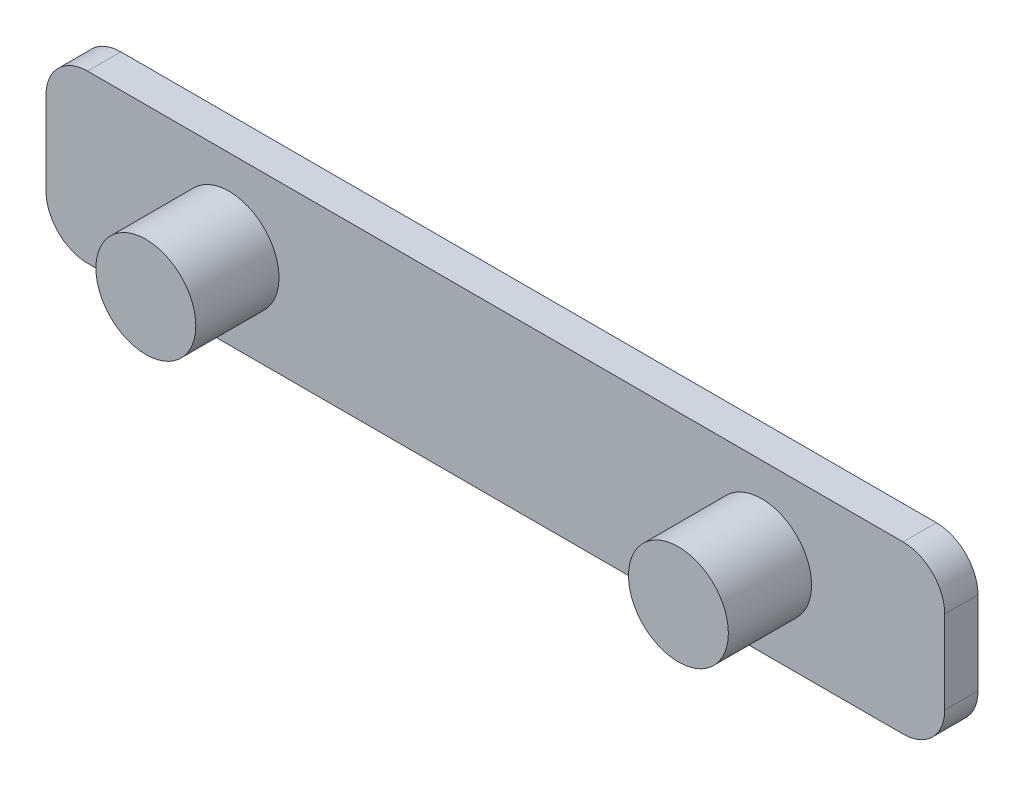
ISO-10303-21;
HEADER;
FILE_DESCRIPTION(('STEP AP214'),'2;1');
FILE_NAME('part.step','',(''),(''),'','','');
FILE_SCHEMA(('AUTOMOTIVE_DESIGN { 1 0 10303 214 1 1 1 1 }'));
ENDSEC;
DATA;
#1=APPLICATION_CONTEXT('core data for automotive mechanical design processes');
#2=APPLICATION_PROTOCOL_DEFINITION('international standard','automotive_design',2000,#1);
#3=PRODUCT_CONTEXT('',#1,'mechanical');
#4=PRODUCT('Part','Part','',(#3));
#5=PRODUCT_RELATED_PRODUCT_CATEGORY('part','',(#4));
#6=PRODUCT_DEFINITION_FORMATION('','',#4);
#7=PRODUCT_DEFINITION_CONTEXT('part definition',#1,'design');
#8=PRODUCT_DEFINITION('design','',#6,#7);
#9=PRODUCT_DEFINITION_SHAPE('','',#8);
#10=(LENGTH_UNIT() NAMED_UNIT(*) SI_UNIT(.MILLI.,.METRE.));
#11=(NAMED_UNIT(*) PLANE_ANGLE_UNIT() SI_UNIT($,.RADIAN.));
#12=(NAMED_UNIT(*) SI_UNIT($,.STERADIAN.) SOLID_ANGLE_UNIT());
#13=UNCERTAINTY_MEASURE_WITH_UNIT(LENGTH_MEASURE(1.E-05),#10,'distance_accuracy_value','');
#14=(GEOMETRIC_REPRESENTATION_CONTEXT(3) GLOBAL_UNCERTAINTY_ASSIGNED_CONTEXT((#13)) GLOBAL_UNIT_ASSIGNED_CONTEXT((#10,
#11,#12)) REPRESENTATION_CONTEXT('',''));
#15=CARTESIAN_POINT('',(0.,0.,0.));
#16=DIRECTION('',(0.,0.,1.));
#17=DIRECTION('',(1.,0.,0.));
#18=AXIS2_PLACEMENT_3D('',#15,#16,#17);
#19=CARTESIAN_POINT('',(-5.31333795137197,1.33941413235611,2.));
#20=DIRECTION('',(0.,0.,-1.));
#21=DIRECTION('',(-1.,0.,0.));
#22=AXIS2_PLACEMENT_3D('',#19,#20,#21);
#23=CYLINDRICAL_SURFACE('',#22,2.5);
#24=CARTESIAN_POINT('',(-5.31333795137197,1.33941413235611,0.));
#25=DIRECTION('',(0.,0.,1.));
#26=DIRECTION('',(-1.,0.,0.));
#27=AXIS2_PLACEMENT_3D('',#24,#25,#26);
#28=CIRCLE('',#27,2.5);
#29=CARTESIAN_POINT('',(-5.31333795137195,3.83941413235611,0.));
#30=VERTEX_POINT('',#29);
#31=CARTESIAN_POINT('',(-7.81333795137197,1.33941413235609,0.));
#32=VERTEX_POINT('',#31);
#33=EDGE_CURVE('E140',#30,#32,#28,.T.);
#34=ORIENTED_EDGE('',*,*,#33,.T.);
#35=DIRECTION('',(0.,0.,-1.));
#36=VECTOR('',#35,1.);
#37=CARTESIAN_POINT('',(-7.81333795137197,1.33941413235609,2.));
#38=LINE('',#37,#36);
#39=CARTESIAN_POINT('',(-7.81333795137197,1.33941413235609,2.));
#40=VERTEX_POINT('',#39);
#41=EDGE_CURVE('E168',#40,#32,#38,.T.);
#42=ORIENTED_EDGE('',*,*,#41,.F.);
#43=CARTESIAN_POINT('',(-5.31333795137197,1.33941413235611,2.));
#44=DIRECTION('',(0.,0.,1.));
#45=DIRECTION('',(-1.,0.,0.));
#46=AXIS2_PLACEMENT_3D('',#43,#44,#45);
#47=CIRCLE('',#46,2.5);
#48=CARTESIAN_POINT('',(-5.31333795137195,3.83941413235611,2.));
#49=VERTEX_POINT('',#48);
#50=EDGE_CURVE('E155',#49,#40,#47,.T.);
#51=ORIENTED_EDGE('',*,*,#50,.F.);
#52=DIRECTION('',(0.,0.,-1.));
#53=VECTOR('',#52,1.);
#54=CARTESIAN_POINT('',(-5.31333795137195,3.83941413235611,2.));
#55=LINE('',#54,#53);
#56=EDGE_CURVE('E136',#49,#30,#55,.T.);
#57=ORIENTED_EDGE('',*,*,#56,.T.);
#58=EDGE_LOOP('',(#34,#42,#51,#57));
#59=FACE_BOUND('',#58,.T.);
#60=ADVANCED_FACE('F43',(#59),#23,.T.);
#61=CARTESIAN_POINT('',(-7.81333795137197,1.33941413235609,2.));
#62=DIRECTION('',(1.,0.,0.));
#63=DIRECTION('',(0.,1.,0.));
#64=AXIS2_PLACEMENT_3D('',#61,#62,#63);
#65=PLANE('',#64);
#66=DIRECTION('',(0.,-1.,0.));
#67=VECTOR('',#66,1.);
#68=CARTESIAN_POINT('',(-7.81333795137197,1.33941413235609,0.));
#69=LINE('',#68,#67);
#70=CARTESIAN_POINT('',(-7.81333795137197,-3.66058586764387,0.));
#71=VERTEX_POINT('',#70);
#72=EDGE_CURVE('E143',#32,#71,#69,.T.);
#73=ORIENTED_EDGE('',*,*,#72,.T.);
#74=DIRECTION('',(0.,0.,-1.));
#75=VECTOR('',#74,1.);
#76=CARTESIAN_POINT('',(-7.81333795137197,-3.66058586764387,2.));
#77=LINE('',#76,#75);
#78=CARTESIAN_POINT('',(-7.81333795137197,-3.66058586764387,2.));
#79=VERTEX_POINT('',#78);
#80=EDGE_CURVE('E165',#79,#71,#77,.T.);
#81=ORIENTED_EDGE('',*,*,#80,.F.);
#82=DIRECTION('',(0.,-1.,0.));
#83=VECTOR('',#82,1.);
#84=CARTESIAN_POINT('',(-7.81333795137197,1.33941413235609,2.));
#85=LINE('',#84,#83);
#86=EDGE_CURVE('E103',#40,#79,#85,.T.);
#87=ORIENTED_EDGE('',*,*,#86,.F.);
#88=ORIENTED_EDGE('',*,*,#41,.T.);
#89=EDGE_LOOP('',(#73,#81,#87,#88));
#90=FACE_BOUND('',#89,.T.);
#91=ADVANCED_FACE('F190',(#90),#65,.F.);
#92=CARTESIAN_POINT('',(-5.31333795137197,-3.66058586764389,2.));
#93=DIRECTION('',(0.,0.,-1.));
#94=DIRECTION('',(-1.,0.,0.));
#95=AXIS2_PLACEMENT_3D('',#92,#93,#94);
#96=CYLINDRICAL_SURFACE('',#95,2.5);
#97=CARTESIAN_POINT('',(-5.31333795137197,-3.66058586764389,0.));
#98=DIRECTION('',(0.,0.,1.));
#99=DIRECTION('',(1.,0.,0.));
#100=AXIS2_PLACEMENT_3D('',#97,#98,#99);
#101=CIRCLE('',#100,2.5);
#102=CARTESIAN_POINT('',(-5.31333795137196,-6.16058586764389,0.));
#103=VERTEX_POINT('',#102);
#104=EDGE_CURVE('E146',#71,#103,#101,.T.);
#105=ORIENTED_EDGE('',*,*,#104,.T.);
#106=DIRECTION('',(0.,0.,-1.));
#107=VECTOR('',#106,1.);
#108=CARTESIAN_POINT('',(-5.31333795137196,-6.16058586764389,2.));
#109=LINE('',#108,#107);
#110=CARTESIAN_POINT('',(-5.31333795137196,-6.16058586764389,2.));
#111=VERTEX_POINT('',#110);
#112=EDGE_CURVE('E162',#111,#103,#109,.T.);
#113=ORIENTED_EDGE('',*,*,#112,.F.);
#114=CARTESIAN_POINT('',(-5.31333795137197,-3.66058586764389,2.));
#115=DIRECTION('',(0.,0.,1.));
#116=DIRECTION('',(1.,0.,0.));
#117=AXIS2_PLACEMENT_3D('',#114,#115,#116);
#118=CIRCLE('',#117,2.5);
#119=EDGE_CURVE('E204',#79,#111,#118,.T.);
#120=ORIENTED_EDGE('',*,*,#119,.F.);
#121=ORIENTED_EDGE('',*,*,#80,.T.);
#122=EDGE_LOOP('',(#105,#113,#120,#121));
#123=FACE_BOUND('',#122,.T.);
#124=ADVANCED_FACE('F195',(#123),#96,.T.);
#125=CARTESIAN_POINT('',(-5.31333795137195,-6.16058586764389,2.));
#126=DIRECTION('',(0.,1.,0.));
#127=DIRECTION('',(0.,0.,1.));
#128=AXIS2_PLACEMENT_3D('',#125,#126,#127);
#129=PLANE('',#128);
#130=DIRECTION('',(1.,0.,0.));
#131=VECTOR('',#130,1.);
#132=CARTESIAN_POINT('',(-5.31333795137195,-6.16058586764389,0.));
#133=LINE('',#132,#131);
#134=CARTESIAN_POINT('',(43.686662048628,-6.16058586764389,0.));
#135=VERTEX_POINT('',#134);
#136=EDGE_CURVE('E148',#103,#135,#133,.T.);
#137=ORIENTED_EDGE('',*,*,#136,.T.);
#138=DIRECTION('',(0.,0.,-1.));
#139=VECTOR('',#138,1.);
#140=CARTESIAN_POINT('',(43.686662048628,-6.16058586764389,2.));
#141=LINE('',#140,#139);
#142=CARTESIAN_POINT('',(43.686662048628,-6.16058586764389,2.));
#143=VERTEX_POINT('',#142);
#144=EDGE_CURVE('E159',#143,#135,#141,.T.);
#145=ORIENTED_EDGE('',*,*,#144,.F.);
#146=DIRECTION('',(1.,0.,0.));
#147=VECTOR('',#146,1.);
#148=CARTESIAN_POINT('',(-5.31333795137195,-6.16058586764389,2.));
#149=LINE('',#148,#147);
#150=EDGE_CURVE('E206',#111,#143,#149,.T.);
#151=ORIENTED_EDGE('',*,*,#150,.F.);
#152=ORIENTED_EDGE('',*,*,#112,.T.);
#153=EDGE_LOOP('',(#137,#145,#151,#152));
#154=FACE_BOUND('',#153,.T.);
#155=ADVANCED_FACE('F290',(#154),#129,.F.);
#156=CARTESIAN_POINT('',(43.686662048628,-3.66058586764389,2.));
#157=DIRECTION('',(0.,0.,-1.));
#158=DIRECTION('',(-1.,0.,0.));
#159=AXIS2_PLACEMENT_3D('',#156,#157,#158);
#160=CYLINDRICAL_SURFACE('',#159,2.5);
#161=CARTESIAN_POINT('',(43.686662048628,-3.66058586764389,0.));
#162=DIRECTION('',(0.,0.,1.));
#163=DIRECTION('',(-1.,0.,0.));
#164=AXIS2_PLACEMENT_3D('',#161,#162,#163);
#165=CIRCLE('',#164,2.5);
#166=CARTESIAN_POINT('',(46.186662048628,-3.66058586764389,0.));
#167=VERTEX_POINT('',#166);
#168=EDGE_CURVE('E150',#135,#167,#165,.T.);
#169=ORIENTED_EDGE('',*,*,#168,.T.);
#170=DIRECTION('',(0.,0.,-1.));
#171=VECTOR('',#170,1.);
#172=CARTESIAN_POINT('',(46.186662048628,-3.66058586764389,2.));
#173=LINE('',#172,#171);
#174=CARTESIAN_POINT('',(46.186662048628,-3.66058586764389,2.));
#175=VERTEX_POINT('',#174);
#176=EDGE_CURVE('E131',#175,#167,#173,.T.);
#177=ORIENTED_EDGE('',*,*,#176,.F.);
#178=CARTESIAN_POINT('',(43.686662048628,-3.66058586764389,2.));
#179=DIRECTION('',(0.,0.,1.));
#180=DIRECTION('',(-1.,0.,0.));
#181=AXIS2_PLACEMENT_3D('',#178,#179,#180);
#182=CIRCLE('',#181,2.5);
#183=EDGE_CURVE('E122',#143,#175,#182,.T.);
#184=ORIENTED_EDGE('',*,*,#183,.F.);
#185=ORIENTED_EDGE('',*,*,#144,.T.);
#186=EDGE_LOOP('',(#169,#177,#184,#185));
#187=FACE_BOUND('',#186,.T.);
#188=ADVANCED_FACE('F282',(#187),#160,.T.);
#189=CARTESIAN_POINT('',(46.186662048628,1.33941413235611,2.));
#190=DIRECTION('',(-1.,0.,0.));
#191=DIRECTION('',(0.,0.,1.));
#192=AXIS2_PLACEMENT_3D('',#189,#190,#191);
#193=PLANE('',#192);
#194=DIRECTION('',(0.,1.,0.));
#195=VECTOR('',#194,1.);
#196=CARTESIAN_POINT('',(46.186662048628,1.33941413235611,0.));
#197=LINE('',#196,#195);
#198=CARTESIAN_POINT('',(46.186662048628,1.33941413235611,0.));
#199=VERTEX_POINT('',#198);
#200=EDGE_CURVE('E130',#167,#199,#197,.T.);
#201=ORIENTED_EDGE('',*,*,#200,.T.);
#202=DIRECTION('',(0.,0.,-1.));
#203=VECTOR('',#202,1.);
#204=CARTESIAN_POINT('',(46.186662048628,1.33941413235611,2.));
#205=LINE('',#204,#203);
#206=CARTESIAN_POINT('',(46.186662048628,1.33941413235611,2.));
#207=VERTEX_POINT('',#206);
#208=EDGE_CURVE('E127',#207,#199,#205,.T.);
#209=ORIENTED_EDGE('',*,*,#208,.F.);
#210=DIRECTION('',(0.,1.,0.));
#211=VECTOR('',#210,1.);
#212=CARTESIAN_POINT('',(46.186662048628,1.33941413235611,2.));
#213=LINE('',#212,#211);
#214=EDGE_CURVE('E116',#175,#207,#213,.T.);
#215=ORIENTED_EDGE('',*,*,#214,.F.);
#216=ORIENTED_EDGE('',*,*,#176,.T.);
#217=EDGE_LOOP('',(#201,#209,#215,#216));
#218=FACE_BOUND('',#217,.T.);
#219=ADVANCED_FACE('F128',(#218),#193,.F.);
#220=CARTESIAN_POINT('',(43.686662048628,1.33941413235611,2.));
#221=DIRECTION('',(0.,0.,-1.));
#222=DIRECTION('',(-1.,0.,0.));
#223=AXIS2_PLACEMENT_3D('',#220,#221,#222);
#224=CYLINDRICAL_SURFACE('',#223,2.5);
#225=CARTESIAN_POINT('',(43.686662048628,1.33941413235611,0.));
#226=DIRECTION('',(0.,0.,1.));
#227=DIRECTION('',(1.,0.,0.));
#228=AXIS2_PLACEMENT_3D('',#225,#226,#227);
#229=CIRCLE('',#228,2.5);
#230=CARTESIAN_POINT('',(43.686662048628,3.83941413235611,0.));
#231=VERTEX_POINT('',#230);
#232=EDGE_CURVE('E88',#199,#231,#229,.T.);
#233=ORIENTED_EDGE('',*,*,#232,.T.);
#234=DIRECTION('',(0.,0.,-1.));
#235=VECTOR('',#234,1.);
#236=CARTESIAN_POINT('',(43.686662048628,3.83941413235611,2.));
#237=LINE('',#236,#235);
#238=CARTESIAN_POINT('',(43.686662048628,3.83941413235611,2.));
#239=VERTEX_POINT('',#238);
#240=EDGE_CURVE('E132',#239,#231,#237,.T.);
#241=ORIENTED_EDGE('',*,*,#240,.F.);
#242=CARTESIAN_POINT('',(43.686662048628,1.33941413235611,2.));
#243=DIRECTION('',(0.,0.,1.));
#244=DIRECTION('',(1.,0.,0.));
#245=AXIS2_PLACEMENT_3D('',#242,#243,#244);
#246=CIRCLE('',#245,2.5);
#247=EDGE_CURVE('E120',#207,#239,#246,.T.);
#248=ORIENTED_EDGE('',*,*,#247,.F.);
#249=ORIENTED_EDGE('',*,*,#208,.T.);
#250=EDGE_LOOP('',(#233,#241,#248,#249));
#251=FACE_BOUND('',#250,.T.);
#252=ADVANCED_FACE('F134',(#251),#224,.T.);
#253=CARTESIAN_POINT('',(-5.31333795137195,3.83941413235611,2.));
#254=DIRECTION('',(0.,-1.,0.));
#255=DIRECTION('',(1.,0.,0.));
#256=AXIS2_PLACEMENT_3D('',#253,#254,#255);
#257=PLANE('',#256);
#258=DIRECTION('',(-1.,0.,0.));
#259=VECTOR('',#258,1.);
#260=CARTESIAN_POINT('',(-5.31333795137195,3.83941413235611,0.));
#261=LINE('',#260,#259);
#262=EDGE_CURVE('E94',#231,#30,#261,.T.);
#263=ORIENTED_EDGE('',*,*,#262,.T.);
#264=ORIENTED_EDGE('',*,*,#56,.F.);
#265=DIRECTION('',(-1.,0.,0.));
#266=VECTOR('',#265,1.);
#267=CARTESIAN_POINT('',(-5.31333795137195,3.83941413235611,2.));
#268=LINE('',#267,#266);
#269=EDGE_CURVE('E59',#239,#49,#268,.T.);
#270=ORIENTED_EDGE('',*,*,#269,.F.);
#271=ORIENTED_EDGE('',*,*,#240,.T.);
#272=EDGE_LOOP('',(#263,#264,#270,#271));
#273=FACE_BOUND('',#272,.T.);
#274=ADVANCED_FACE('F176',(#273),#257,.F.);
#275=CARTESIAN_POINT('',(-5.31333795137197,1.33941413235611,2.));
#276=DIRECTION('',(0.,0.,-1.));
#277=DIRECTION('',(-1.,0.,0.));
#278=AXIS2_PLACEMENT_3D('',#275,#276,#277);
#279=PLANE('',#278);
#280=CARTESIAN_POINT('',(3.18666204862802,-1.16058586764389,2.));
#281=DIRECTION('',(0.,0.,-1.));
#282=DIRECTION('',(-1.,0.,0.));
#283=AXIS2_PLACEMENT_3D('',#280,#281,#282);
#284=CIRCLE('',#283,3.);
#285=CARTESIAN_POINT('',(0.186662048628024,-1.16058586764389,2.));
#286=VERTEX_POINT('',#285);
#287=EDGE_CURVE('E11',#286,#286,#284,.F.);
#288=ORIENTED_EDGE('',*,*,#287,.F.);
#289=EDGE_LOOP('',(#288));
#290=FACE_BOUND('',#289,.T.);
#291=CARTESIAN_POINT('',(35.186662048628,-1.16058586764389,2.));
#292=DIRECTION('',(0.,0.,-1.));
#293=DIRECTION('',(-1.,0.,0.));
#294=AXIS2_PLACEMENT_3D('',#291,#292,#293);
#295=CIRCLE('',#294,3.);
#296=CARTESIAN_POINT('',(32.186662048628,-1.16058586764389,2.));
#297=VERTEX_POINT('',#296);
#298=EDGE_CURVE('E51',#297,#297,#295,.F.);
#299=ORIENTED_EDGE('',*,*,#298,.F.);
#300=EDGE_LOOP('',(#299));
#301=FACE_BOUND('',#300,.T.);
#302=ORIENTED_EDGE('',*,*,#50,.T.);
#303=ORIENTED_EDGE('',*,*,#86,.T.);
#304=ORIENTED_EDGE('',*,*,#119,.T.);
#305=ORIENTED_EDGE('',*,*,#150,.T.);
#306=ORIENTED_EDGE('',*,*,#183,.T.);
#307=ORIENTED_EDGE('',*,*,#214,.T.);
#308=ORIENTED_EDGE('',*,*,#247,.T.);
#309=ORIENTED_EDGE('',*,*,#269,.T.);
#310=EDGE_LOOP('',(#302,#303,#304,#305,#306,#307,#308,#309));
#311=FACE_BOUND('',#310,.T.);
#312=ADVANCED_FACE('F118',(#290,#301,#311),#279,.F.);
#313=CARTESIAN_POINT('',(-5.31333795137197,1.33941413235611,0.));
#314=DIRECTION('',(0.,0.,-1.));
#315=DIRECTION('',(-1.,0.,0.));
#316=AXIS2_PLACEMENT_3D('',#313,#314,#315);
#317=PLANE('',#316);
#318=ORIENTED_EDGE('',*,*,#33,.F.);
#319=ORIENTED_EDGE('',*,*,#262,.F.);
#320=ORIENTED_EDGE('',*,*,#232,.F.);
#321=ORIENTED_EDGE('',*,*,#200,.F.);
#322=ORIENTED_EDGE('',*,*,#168,.F.);
#323=ORIENTED_EDGE('',*,*,#136,.F.);
#324=ORIENTED_EDGE('',*,*,#104,.F.);
#325=ORIENTED_EDGE('',*,*,#72,.F.);
#326=EDGE_LOOP('',(#318,#319,#320,#321,#322,#323,#324,#325));
#327=FACE_BOUND('',#326,.T.);
#328=ADVANCED_FACE('F175',(#327),#317,.T.);
#329=CARTESIAN_POINT('',(35.186662048628,-1.16058586764389,7.));
#330=DIRECTION('',(0.,0.,-1.));
#331=DIRECTION('',(-1.,0.,0.));
#332=AXIS2_PLACEMENT_3D('',#329,#330,#331);
#333=CYLINDRICAL_SURFACE('',#332,3.);
#334=CARTESIAN_POINT('',(35.186662048628,-1.16058586764389,7.));
#335=DIRECTION('',(0.,0.,1.));
#336=DIRECTION('',(1.,0.,0.));
#337=AXIS2_PLACEMENT_3D('',#334,#335,#336);
#338=CIRCLE('',#337,3.);
#339=CARTESIAN_POINT('',(38.186662048628,-1.16058586764389,7.));
#340=VERTEX_POINT('',#339);
#341=EDGE_CURVE('E212',#340,#340,#338,.T.);
#342=ORIENTED_EDGE('',*,*,#341,.F.);
#343=EDGE_LOOP('',(#342));
#344=FACE_BOUND('',#343,.T.);
#345=ORIENTED_EDGE('',*,*,#298,.T.);
#346=EDGE_LOOP('',(#345));
#347=FACE_BOUND('',#346,.T.);
#348=ADVANCED_FACE('F172',(#344,#347),#333,.T.);
#349=CARTESIAN_POINT('',(35.186662048628,-1.16058586764389,7.));
#350=DIRECTION('',(0.,0.,1.));
#351=DIRECTION('',(1.,0.,0.));
#352=AXIS2_PLACEMENT_3D('',#349,#350,#351);
#353=PLANE('',#352);
#354=ORIENTED_EDGE('',*,*,#341,.T.);
#355=EDGE_LOOP('',(#354));
#356=FACE_BOUND('',#355,.T.);
#357=ADVANCED_FACE('F223',(#356),#353,.T.);
#358=CARTESIAN_POINT('',(3.18666204862802,-1.16058586764389,7.));
#359=DIRECTION('',(0.,0.,-1.));
#360=DIRECTION('',(-1.,0.,0.));
#361=AXIS2_PLACEMENT_3D('',#358,#359,#360);
#362=CYLINDRICAL_SURFACE('',#361,3.);
#363=CARTESIAN_POINT('',(3.18666204862802,-1.16058586764389,7.));
#364=DIRECTION('',(0.,0.,1.));
#365=DIRECTION('',(1.,0.,0.));
#366=AXIS2_PLACEMENT_3D('',#363,#364,#365);
#367=CIRCLE('',#366,3.);
#368=CARTESIAN_POINT('',(6.18666204862802,-1.16058586764389,7.));
#369=VERTEX_POINT('',#368);
#370=EDGE_CURVE('E144',#369,#369,#367,.T.);
#371=ORIENTED_EDGE('',*,*,#370,.F.);
#372=EDGE_LOOP('',(#371));
#373=FACE_BOUND('',#372,.T.);
#374=ORIENTED_EDGE('',*,*,#287,.T.);
#375=EDGE_LOOP('',(#374));
#376=FACE_BOUND('',#375,.T.);
#377=ADVANCED_FACE('F220',(#373,#376),#362,.T.);
#378=CARTESIAN_POINT('',(3.18666204862802,-1.16058586764389,7.));
#379=DIRECTION('',(0.,0.,1.));
#380=DIRECTION('',(1.,0.,0.));
#381=AXIS2_PLACEMENT_3D('',#378,#379,#380);
#382=PLANE('',#381);
#383=ORIENTED_EDGE('',*,*,#370,.T.);
#384=EDGE_LOOP('',(#383));
#385=FACE_BOUND('',#384,.T.);
#386=ADVANCED_FACE('F218',(#385),#382,.T.);
#387=CLOSED_SHELL('',(#60,#91,#124,#155,#188,#219,#252,#274,#312,#328,#348,#357,#377,#386));
#388=MANIFOLD_SOLID_BREP('B2',#387);
#389=ADVANCED_BREP_SHAPE_REPRESENTATION('',(#18,#388),#14);
#390=SHAPE_DEFINITION_REPRESENTATION(#9,#389);
ENDSEC;
END-ISO-10303-21;
